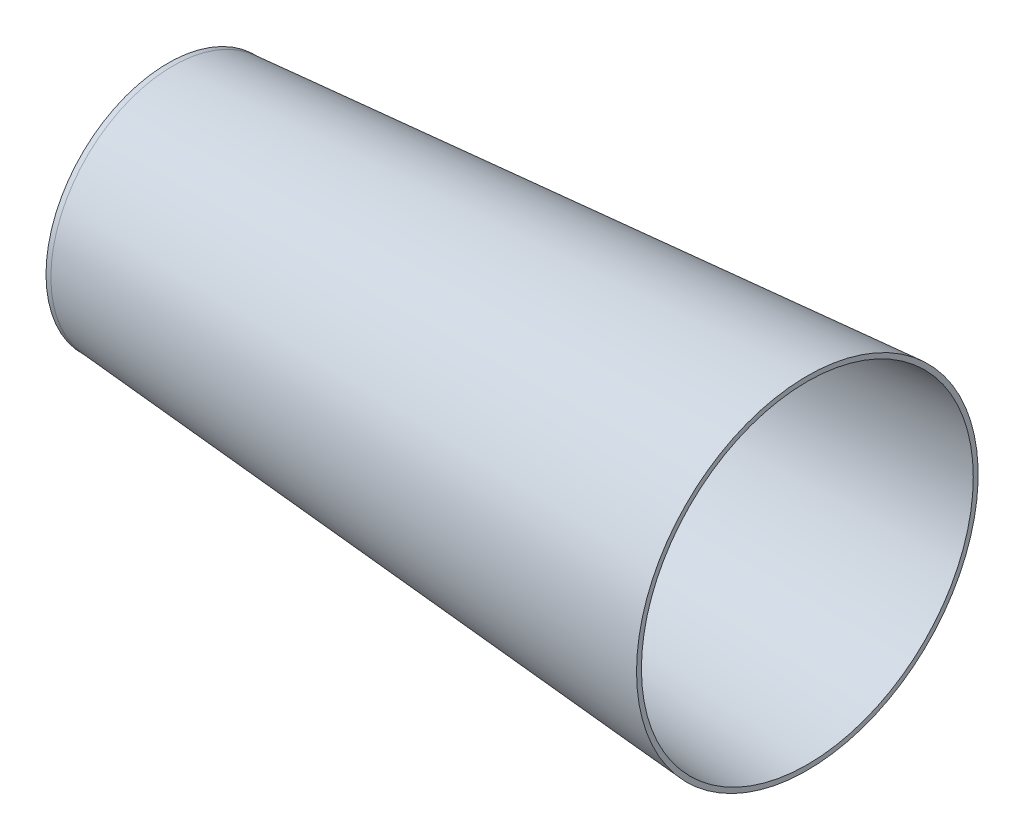
ISO-10303-21;
HEADER;
FILE_DESCRIPTION(('STEP AP214'),'2;1');
FILE_NAME('part.step','',(''),(''),'','','');
FILE_SCHEMA(('AUTOMOTIVE_DESIGN { 1 0 10303 214 1 1 1 1 }'));
ENDSEC;
DATA;
#1=APPLICATION_CONTEXT('core data for automotive mechanical design processes');
#2=APPLICATION_PROTOCOL_DEFINITION('international standard','automotive_design',2000,#1);
#3=PRODUCT_CONTEXT('',#1,'mechanical');
#4=PRODUCT('Part','Part','',(#3));
#5=PRODUCT_RELATED_PRODUCT_CATEGORY('part','',(#4));
#6=PRODUCT_DEFINITION_FORMATION('','',#4);
#7=PRODUCT_DEFINITION_CONTEXT('part definition',#1,'design');
#8=PRODUCT_DEFINITION('design','',#6,#7);
#9=PRODUCT_DEFINITION_SHAPE('','',#8);
#10=(LENGTH_UNIT() NAMED_UNIT(*) SI_UNIT(.MILLI.,.METRE.));
#11=(NAMED_UNIT(*) PLANE_ANGLE_UNIT() SI_UNIT($,.RADIAN.));
#12=(NAMED_UNIT(*) SI_UNIT($,.STERADIAN.) SOLID_ANGLE_UNIT());
#13=UNCERTAINTY_MEASURE_WITH_UNIT(LENGTH_MEASURE(1.E-05),#10,'distance_accuracy_value','');
#14=(GEOMETRIC_REPRESENTATION_CONTEXT(3) GLOBAL_UNCERTAINTY_ASSIGNED_CONTEXT((#13)) GLOBAL_UNIT_ASSIGNED_CONTEXT((#10,
#11,#12)) REPRESENTATION_CONTEXT('',''));
#15=CARTESIAN_POINT('',(0.,0.,0.));
#16=DIRECTION('',(0.,0.,1.));
#17=DIRECTION('',(1.,0.,0.));
#18=AXIS2_PLACEMENT_3D('',#15,#16,#17);
#19=CARTESIAN_POINT('',(-38.2737146450701,0.,0.));
#20=DIRECTION('',(1.,0.,0.));
#21=DIRECTION('',(0.,0.,-1.));
#22=AXIS2_PLACEMENT_3D('',#19,#20,#21);
#23=PLANE('',#22);
#24=CARTESIAN_POINT('',(-38.2737146450701,0.,0.));
#25=DIRECTION('',(-1.,0.,0.));
#26=DIRECTION('',(0.,0.,1.));
#27=AXIS2_PLACEMENT_3D('',#24,#25,#26);
#28=CIRCLE('',#27,25.);
#29=CARTESIAN_POINT('',(-38.2737146450701,0.,25.));
#30=VERTEX_POINT('',#29);
#31=EDGE_CURVE('E10',#30,#30,#28,.T.);
#32=ORIENTED_EDGE('',*,*,#31,.T.);
#33=EDGE_LOOP('',(#32));
#34=FACE_BOUND('',#33,.T.);
#35=ADVANCED_FACE('F29',(#34),#23,.F.);
#36=CARTESIAN_POINT('',(-48.948507426939,0.,0.));
#37=DIRECTION('',(-1.,0.,0.));
#38=DIRECTION('',(0.,0.,1.));
#39=AXIS2_PLACEMENT_3D('',#36,#37,#38);
#40=CYLINDRICAL_SURFACE('',#39,25.);
#41=ORIENTED_EDGE('',*,*,#31,.F.);
#42=EDGE_LOOP('',(#41));
#43=FACE_BOUND('',#42,.T.);
#44=CARTESIAN_POINT('',(-37.2737146450701,0.,0.));
#45=DIRECTION('',(-1.,0.,0.));
#46=DIRECTION('',(0.,0.,1.));
#47=AXIS2_PLACEMENT_3D('',#44,#45,#46);
#48=CIRCLE('',#47,25.);
#49=CARTESIAN_POINT('',(-37.2737146450701,0.,25.));
#50=VERTEX_POINT('',#49);
#51=EDGE_CURVE('E35',#50,#50,#48,.T.);
#52=ORIENTED_EDGE('',*,*,#51,.T.);
#53=EDGE_LOOP('',(#52));
#54=FACE_BOUND('',#53,.T.);
#55=ADVANCED_FACE('F64',(#43,#54),#40,.T.);
#56=CARTESIAN_POINT('',(92.7262853549299,0.,0.));
#57=DIRECTION('',(1.,0.,0.));
#58=DIRECTION('',(0.,0.,-1.));
#59=AXIS2_PLACEMENT_3D('',#56,#57,#58);
#60=CONICAL_SURFACE('',#59,35.,0.0767718912697781);
#61=ORIENTED_EDGE('',*,*,#51,.F.);
#62=EDGE_LOOP('',(#61));
#63=FACE_BOUND('',#62,.T.);
#64=CARTESIAN_POINT('',(92.7262853549299,0.,0.));
#65=DIRECTION('',(-1.,0.,0.));
#66=DIRECTION('',(0.,0.,1.));
#67=AXIS2_PLACEMENT_3D('',#64,#65,#66);
#68=CIRCLE('',#67,35.);
#69=CARTESIAN_POINT('',(92.7262853549299,0.,35.));
#70=VERTEX_POINT('',#69);
#71=EDGE_CURVE('E39',#70,#70,#68,.T.);
#72=ORIENTED_EDGE('',*,*,#71,.T.);
#73=EDGE_LOOP('',(#72));
#74=FACE_BOUND('',#73,.T.);
#75=ADVANCED_FACE('F68',(#63,#74),#60,.T.);
#76=CARTESIAN_POINT('',(92.7262853549299,35.,0.));
#77=DIRECTION('',(-1.,0.,0.));
#78=DIRECTION('',(0.,0.,1.));
#79=AXIS2_PLACEMENT_3D('',#76,#77,#78);
#80=PLANE('',#79);
#81=ORIENTED_EDGE('',*,*,#71,.F.);
#82=EDGE_LOOP('',(#81));
#83=FACE_BOUND('',#82,.T.);
#84=CARTESIAN_POINT('',(92.7262853549299,0.,0.));
#85=DIRECTION('',(-1.,0.,0.));
#86=DIRECTION('',(0.,0.,1.));
#87=AXIS2_PLACEMENT_3D('',#84,#85,#86);
#88=CIRCLE('',#87,34.);
#89=CARTESIAN_POINT('',(92.7262853549299,0.,34.));
#90=VERTEX_POINT('',#89);
#91=EDGE_CURVE('E43',#90,#90,#88,.T.);
#92=ORIENTED_EDGE('',*,*,#91,.T.);
#93=EDGE_LOOP('',(#92));
#94=FACE_BOUND('',#93,.T.);
#95=ADVANCED_FACE('F60',(#83,#94),#80,.F.);
#96=CARTESIAN_POINT('',(-37.2737146450701,0.,0.));
#97=DIRECTION('',(1.,0.,0.));
#98=DIRECTION('',(0.,0.,-1.));
#99=AXIS2_PLACEMENT_3D('',#96,#97,#98);
#100=CONICAL_SURFACE('',#99,24.,0.0767718912697781);
#101=ORIENTED_EDGE('',*,*,#91,.F.);
#102=EDGE_LOOP('',(#101));
#103=FACE_BOUND('',#102,.T.);
#104=CARTESIAN_POINT('',(-37.2737146450701,0.,0.));
#105=DIRECTION('',(-1.,0.,0.));
#106=DIRECTION('',(0.,0.,1.));
#107=AXIS2_PLACEMENT_3D('',#104,#105,#106);
#108=CIRCLE('',#107,24.);
#109=CARTESIAN_POINT('',(-37.2737146450701,0.,24.));
#110=VERTEX_POINT('',#109);
#111=EDGE_CURVE('E48',#110,#110,#108,.T.);
#112=ORIENTED_EDGE('',*,*,#111,.T.);
#113=EDGE_LOOP('',(#112));
#114=FACE_BOUND('',#113,.T.);
#115=ADVANCED_FACE('F52',(#103,#114),#100,.F.);
#116=CARTESIAN_POINT('',(-37.2737146450701,0.,0.));
#117=DIRECTION('',(-1.,0.,0.));
#118=DIRECTION('',(0.,0.,1.));
#119=AXIS2_PLACEMENT_3D('',#116,#117,#118);
#120=PLANE('',#119);
#121=ORIENTED_EDGE('',*,*,#111,.F.);
#122=EDGE_LOOP('',(#121));
#123=FACE_BOUND('',#122,.T.);
#124=ADVANCED_FACE('F54',(#123),#120,.F.);
#125=CLOSED_SHELL('',(#35,#55,#75,#95,#115,#124));
#126=MANIFOLD_SOLID_BREP('B2',#125);
#127=ADVANCED_BREP_SHAPE_REPRESENTATION('',(#18,#126),#14);
#128=SHAPE_DEFINITION_REPRESENTATION(#9,#127);
ENDSEC;
END-ISO-10303-21;
